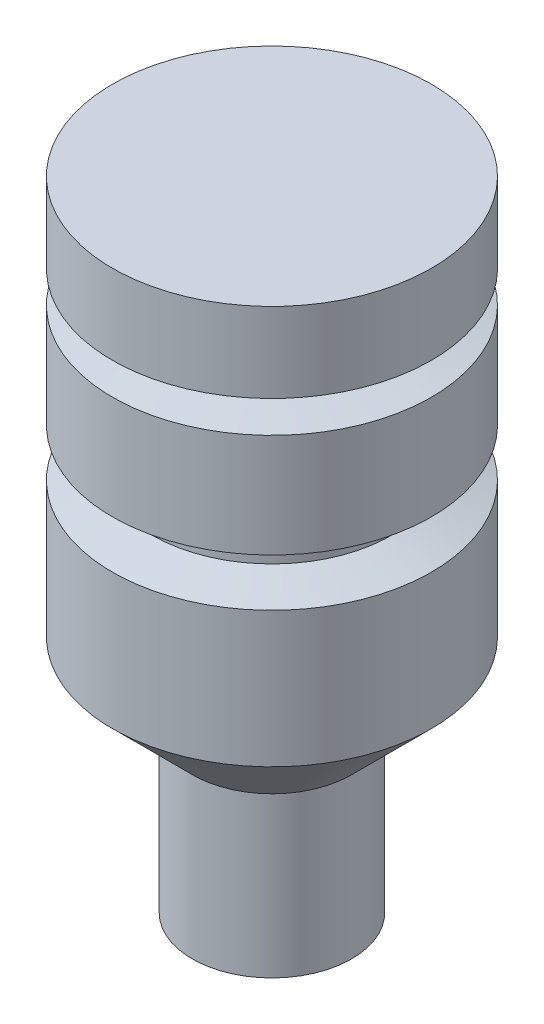
ISO-10303-21;
HEADER;
FILE_DESCRIPTION(('STEP AP214'),'2;1');
FILE_NAME('part.step','',(''),(''),'','','');
FILE_SCHEMA(('AUTOMOTIVE_DESIGN { 1 0 10303 214 1 1 1 1 }'));
ENDSEC;
DATA;
#1=APPLICATION_CONTEXT('core data for automotive mechanical design processes');
#2=APPLICATION_PROTOCOL_DEFINITION('international standard','automotive_design',2000,#1);
#3=PRODUCT_CONTEXT('',#1,'mechanical');
#4=PRODUCT('Part','Part','',(#3));
#5=PRODUCT_RELATED_PRODUCT_CATEGORY('part','',(#4));
#6=PRODUCT_DEFINITION_FORMATION('','',#4);
#7=PRODUCT_DEFINITION_CONTEXT('part definition',#1,'design');
#8=PRODUCT_DEFINITION('design','',#6,#7);
#9=PRODUCT_DEFINITION_SHAPE('','',#8);
#10=(LENGTH_UNIT() NAMED_UNIT(*) SI_UNIT(.MILLI.,.METRE.));
#11=(NAMED_UNIT(*) PLANE_ANGLE_UNIT() SI_UNIT($,.RADIAN.));
#12=(NAMED_UNIT(*) SI_UNIT($,.STERADIAN.) SOLID_ANGLE_UNIT());
#13=UNCERTAINTY_MEASURE_WITH_UNIT(LENGTH_MEASURE(1.E-05),#10,'distance_accuracy_value','');
#14=(GEOMETRIC_REPRESENTATION_CONTEXT(3) GLOBAL_UNCERTAINTY_ASSIGNED_CONTEXT((#13)) GLOBAL_UNIT_ASSIGNED_CONTEXT((#10,
#11,#12)) REPRESENTATION_CONTEXT('',''));
#15=CARTESIAN_POINT('',(0.,0.,0.));
#16=DIRECTION('',(0.,0.,1.));
#17=DIRECTION('',(1.,0.,0.));
#18=AXIS2_PLACEMENT_3D('',#15,#16,#17);
#19=CARTESIAN_POINT('',(5.,0.,0.));
#20=DIRECTION('',(0.,-1.,0.));
#21=DIRECTION('',(0.,0.,-1.));
#22=AXIS2_PLACEMENT_3D('',#19,#20,#21);
#23=PLANE('',#22);
#24=CARTESIAN_POINT('',(0.,0.,0.));
#25=DIRECTION('',(0.,-1.,0.));
#26=DIRECTION('',(0.,0.,-1.));
#27=AXIS2_PLACEMENT_3D('',#24,#25,#26);
#28=CIRCLE('',#27,1.25);
#29=CARTESIAN_POINT('',(0.,0.,-1.25));
#30=VERTEX_POINT('',#29);
#31=EDGE_CURVE('E61',#30,#30,#28,.T.);
#32=ORIENTED_EDGE('',*,*,#31,.F.);
#33=EDGE_LOOP('',(#32));
#34=FACE_BOUND('',#33,.T.);
#35=CARTESIAN_POINT('',(0.,0.,0.));
#36=DIRECTION('',(0.,-1.,0.));
#37=DIRECTION('',(0.,0.,-1.));
#38=AXIS2_PLACEMENT_3D('',#35,#36,#37);
#39=CIRCLE('',#38,5.);
#40=CARTESIAN_POINT('',(0.,0.,-5.));
#41=VERTEX_POINT('',#40);
#42=EDGE_CURVE('E60',#41,#41,#39,.T.);
#43=ORIENTED_EDGE('',*,*,#42,.T.);
#44=EDGE_LOOP('',(#43));
#45=FACE_BOUND('',#44,.T.);
#46=ADVANCED_FACE('F41',(#34,#45),#23,.T.);
#47=CARTESIAN_POINT('',(0.,40.,0.));
#48=DIRECTION('',(0.,1.,0.));
#49=DIRECTION('',(0.,0.,1.));
#50=AXIS2_PLACEMENT_3D('',#47,#48,#49);
#51=PLANE('',#50);
#52=CARTESIAN_POINT('',(0.,40.,0.));
#53=DIRECTION('',(0.,-1.,0.));
#54=DIRECTION('',(0.,0.,-1.));
#55=AXIS2_PLACEMENT_3D('',#52,#53,#54);
#56=CIRCLE('',#55,10.);
#57=CARTESIAN_POINT('',(0.,40.,-10.));
#58=VERTEX_POINT('',#57);
#59=EDGE_CURVE('E11',#58,#58,#56,.T.);
#60=ORIENTED_EDGE('',*,*,#59,.F.);
#61=EDGE_LOOP('',(#60));
#62=FACE_BOUND('',#61,.T.);
#63=ADVANCED_FACE('F102',(#62),#51,.T.);
#64=CARTESIAN_POINT('',(0.,0.,0.));
#65=DIRECTION('',(0.,-1.,0.));
#66=DIRECTION('',(0.,0.,-1.));
#67=AXIS2_PLACEMENT_3D('',#64,#65,#66);
#68=CYLINDRICAL_SURFACE('',#67,10.);
#69=ORIENTED_EDGE('',*,*,#59,.T.);
#70=EDGE_LOOP('',(#69));
#71=FACE_BOUND('',#70,.T.);
#72=CARTESIAN_POINT('',(0.,35.,0.));
#73=DIRECTION('',(0.,-1.,0.));
#74=DIRECTION('',(0.,0.,-1.));
#75=AXIS2_PLACEMENT_3D('',#72,#73,#74);
#76=CIRCLE('',#75,10.);
#77=CARTESIAN_POINT('',(0.,35.,-10.));
#78=VERTEX_POINT('',#77);
#79=EDGE_CURVE('E47',#78,#78,#76,.T.);
#80=ORIENTED_EDGE('',*,*,#79,.F.);
#81=EDGE_LOOP('',(#80));
#82=FACE_BOUND('',#81,.T.);
#83=ADVANCED_FACE('F100',(#71,#82),#68,.T.);
#84=CARTESIAN_POINT('',(0.,34.5,0.));
#85=DIRECTION('',(0.,1.,0.));
#86=DIRECTION('',(0.,0.,1.));
#87=AXIS2_PLACEMENT_3D('',#84,#85,#86);
#88=CONICAL_SURFACE('',#87,7.49999999999998,1.37340076694502);
#89=ORIENTED_EDGE('',*,*,#79,.T.);
#90=EDGE_LOOP('',(#89));
#91=FACE_BOUND('',#90,.T.);
#92=CARTESIAN_POINT('',(0.,34.5,0.));
#93=DIRECTION('',(0.,-1.,0.));
#94=DIRECTION('',(0.,0.,-1.));
#95=AXIS2_PLACEMENT_3D('',#92,#93,#94);
#96=CIRCLE('',#95,7.49999999999998);
#97=CARTESIAN_POINT('',(0.,34.5,-7.49999999999998));
#98=VERTEX_POINT('',#97);
#99=EDGE_CURVE('E92',#98,#98,#96,.T.);
#100=ORIENTED_EDGE('',*,*,#99,.F.);
#101=EDGE_LOOP('',(#100));
#102=FACE_BOUND('',#101,.T.);
#103=ADVANCED_FACE('F97',(#91,#102),#88,.T.);
#104=CARTESIAN_POINT('',(0.,0.,0.));
#105=DIRECTION('',(0.,-1.,0.));
#106=DIRECTION('',(0.,0.,-1.));
#107=AXIS2_PLACEMENT_3D('',#104,#105,#106);
#108=CYLINDRICAL_SURFACE('',#107,7.49999999999998);
#109=ORIENTED_EDGE('',*,*,#99,.T.);
#110=EDGE_LOOP('',(#109));
#111=FACE_BOUND('',#110,.T.);
#112=CARTESIAN_POINT('',(0.,33.5,0.));
#113=DIRECTION('',(0.,-1.,0.));
#114=DIRECTION('',(0.,0.,-1.));
#115=AXIS2_PLACEMENT_3D('',#112,#113,#114);
#116=CIRCLE('',#115,7.49999999999998);
#117=CARTESIAN_POINT('',(0.,33.5,-7.49999999999998));
#118=VERTEX_POINT('',#117);
#119=EDGE_CURVE('E89',#118,#118,#116,.T.);
#120=ORIENTED_EDGE('',*,*,#119,.F.);
#121=EDGE_LOOP('',(#120));
#122=FACE_BOUND('',#121,.T.);
#123=ADVANCED_FACE('F109',(#111,#122),#108,.T.);
#124=CARTESIAN_POINT('',(0.,33.,0.));
#125=DIRECTION('',(0.,-1.,0.));
#126=DIRECTION('',(0.,0.,-1.));
#127=AXIS2_PLACEMENT_3D('',#124,#125,#126);
#128=CONICAL_SURFACE('',#127,10.,1.37340076694502);
#129=ORIENTED_EDGE('',*,*,#119,.T.);
#130=EDGE_LOOP('',(#129));
#131=FACE_BOUND('',#130,.T.);
#132=CARTESIAN_POINT('',(0.,33.,0.));
#133=DIRECTION('',(0.,-1.,0.));
#134=DIRECTION('',(0.,0.,-1.));
#135=AXIS2_PLACEMENT_3D('',#132,#133,#134);
#136=CIRCLE('',#135,10.);
#137=CARTESIAN_POINT('',(0.,33.,-10.));
#138=VERTEX_POINT('',#137);
#139=EDGE_CURVE('E86',#138,#138,#136,.T.);
#140=ORIENTED_EDGE('',*,*,#139,.F.);
#141=EDGE_LOOP('',(#140));
#142=FACE_BOUND('',#141,.T.);
#143=ADVANCED_FACE('F150',(#131,#142),#128,.T.);
#144=CARTESIAN_POINT('',(0.,0.,0.));
#145=DIRECTION('',(0.,-1.,0.));
#146=DIRECTION('',(0.,0.,-1.));
#147=AXIS2_PLACEMENT_3D('',#144,#145,#146);
#148=CYLINDRICAL_SURFACE('',#147,10.);
#149=ORIENTED_EDGE('',*,*,#139,.T.);
#150=EDGE_LOOP('',(#149));
#151=FACE_BOUND('',#150,.T.);
#152=CARTESIAN_POINT('',(0.,26.5,0.));
#153=DIRECTION('',(0.,-1.,0.));
#154=DIRECTION('',(0.,0.,-1.));
#155=AXIS2_PLACEMENT_3D('',#152,#153,#154);
#156=CIRCLE('',#155,10.);
#157=CARTESIAN_POINT('',(0.,26.5,-10.));
#158=VERTEX_POINT('',#157);
#159=EDGE_CURVE('E83',#158,#158,#156,.T.);
#160=ORIENTED_EDGE('',*,*,#159,.F.);
#161=EDGE_LOOP('',(#160));
#162=FACE_BOUND('',#161,.T.);
#163=ADVANCED_FACE('F146',(#151,#162),#148,.T.);
#164=CARTESIAN_POINT('',(0.,25.75,0.));
#165=DIRECTION('',(0.,1.,0.));
#166=DIRECTION('',(0.,0.,1.));
#167=AXIS2_PLACEMENT_3D('',#164,#165,#166);
#168=CONICAL_SURFACE('',#167,7.5,1.27933953231703);
#169=ORIENTED_EDGE('',*,*,#159,.T.);
#170=EDGE_LOOP('',(#169));
#171=FACE_BOUND('',#170,.T.);
#172=CARTESIAN_POINT('',(0.,25.75,0.));
#173=DIRECTION('',(0.,-1.,0.));
#174=DIRECTION('',(0.,0.,-1.));
#175=AXIS2_PLACEMENT_3D('',#172,#173,#174);
#176=CIRCLE('',#175,7.5);
#177=CARTESIAN_POINT('',(0.,25.75,-7.5));
#178=VERTEX_POINT('',#177);
#179=EDGE_CURVE('E80',#178,#178,#176,.T.);
#180=ORIENTED_EDGE('',*,*,#179,.F.);
#181=EDGE_LOOP('',(#180));
#182=FACE_BOUND('',#181,.T.);
#183=ADVANCED_FACE('F142',(#171,#182),#168,.T.);
#184=CARTESIAN_POINT('',(0.,0.,0.));
#185=DIRECTION('',(0.,-1.,0.));
#186=DIRECTION('',(0.,0.,-1.));
#187=AXIS2_PLACEMENT_3D('',#184,#185,#186);
#188=CYLINDRICAL_SURFACE('',#187,7.5);
#189=ORIENTED_EDGE('',*,*,#179,.T.);
#190=EDGE_LOOP('',(#189));
#191=FACE_BOUND('',#190,.T.);
#192=CARTESIAN_POINT('',(0.,24.25,0.));
#193=DIRECTION('',(0.,-1.,0.));
#194=DIRECTION('',(0.,0.,-1.));
#195=AXIS2_PLACEMENT_3D('',#192,#193,#194);
#196=CIRCLE('',#195,7.5);
#197=CARTESIAN_POINT('',(0.,24.25,-7.5));
#198=VERTEX_POINT('',#197);
#199=EDGE_CURVE('E77',#198,#198,#196,.T.);
#200=ORIENTED_EDGE('',*,*,#199,.F.);
#201=EDGE_LOOP('',(#200));
#202=FACE_BOUND('',#201,.T.);
#203=ADVANCED_FACE('F138',(#191,#202),#188,.T.);
#204=CARTESIAN_POINT('',(0.,23.5,0.));
#205=DIRECTION('',(0.,-1.,0.));
#206=DIRECTION('',(0.,0.,-1.));
#207=AXIS2_PLACEMENT_3D('',#204,#205,#206);
#208=CONICAL_SURFACE('',#207,10.,1.27933953231703);
#209=ORIENTED_EDGE('',*,*,#199,.T.);
#210=EDGE_LOOP('',(#209));
#211=FACE_BOUND('',#210,.T.);
#212=CARTESIAN_POINT('',(0.,23.5,0.));
#213=DIRECTION('',(0.,-1.,0.));
#214=DIRECTION('',(0.,0.,-1.));
#215=AXIS2_PLACEMENT_3D('',#212,#213,#214);
#216=CIRCLE('',#215,10.);
#217=CARTESIAN_POINT('',(0.,23.5,-10.));
#218=VERTEX_POINT('',#217);
#219=EDGE_CURVE('E74',#218,#218,#216,.T.);
#220=ORIENTED_EDGE('',*,*,#219,.F.);
#221=EDGE_LOOP('',(#220));
#222=FACE_BOUND('',#221,.T.);
#223=ADVANCED_FACE('F134',(#211,#222),#208,.T.);
#224=CARTESIAN_POINT('',(0.,0.,0.));
#225=DIRECTION('',(0.,-1.,0.));
#226=DIRECTION('',(0.,0.,-1.));
#227=AXIS2_PLACEMENT_3D('',#224,#225,#226);
#228=CYLINDRICAL_SURFACE('',#227,10.);
#229=ORIENTED_EDGE('',*,*,#219,.T.);
#230=EDGE_LOOP('',(#229));
#231=FACE_BOUND('',#230,.T.);
#232=CARTESIAN_POINT('',(0.,15.,0.));
#233=DIRECTION('',(0.,-1.,0.));
#234=DIRECTION('',(0.,0.,-1.));
#235=AXIS2_PLACEMENT_3D('',#232,#233,#234);
#236=CIRCLE('',#235,10.);
#237=CARTESIAN_POINT('',(0.,15.,-10.));
#238=VERTEX_POINT('',#237);
#239=EDGE_CURVE('E71',#238,#238,#236,.T.);
#240=ORIENTED_EDGE('',*,*,#239,.F.);
#241=EDGE_LOOP('',(#240));
#242=FACE_BOUND('',#241,.T.);
#243=ADVANCED_FACE('F127',(#231,#242),#228,.T.);
#244=CARTESIAN_POINT('',(0.,10.,0.));
#245=DIRECTION('',(0.,1.,0.));
#246=DIRECTION('',(0.,0.,1.));
#247=AXIS2_PLACEMENT_3D('',#244,#245,#246);
#248=CONICAL_SURFACE('',#247,5.,0.785398163397449);
#249=ORIENTED_EDGE('',*,*,#239,.T.);
#250=EDGE_LOOP('',(#249));
#251=FACE_BOUND('',#250,.T.);
#252=CARTESIAN_POINT('',(0.,10.,0.));
#253=DIRECTION('',(0.,-1.,0.));
#254=DIRECTION('',(0.,0.,-1.));
#255=AXIS2_PLACEMENT_3D('',#252,#253,#254);
#256=CIRCLE('',#255,5.);
#257=CARTESIAN_POINT('',(0.,10.,-5.));
#258=VERTEX_POINT('',#257);
#259=EDGE_CURVE('E64',#258,#258,#256,.T.);
#260=ORIENTED_EDGE('',*,*,#259,.F.);
#261=EDGE_LOOP('',(#260));
#262=FACE_BOUND('',#261,.T.);
#263=ADVANCED_FACE('F121',(#251,#262),#248,.T.);
#264=CARTESIAN_POINT('',(0.,0.,0.));
#265=DIRECTION('',(0.,-1.,0.));
#266=DIRECTION('',(0.,0.,-1.));
#267=AXIS2_PLACEMENT_3D('',#264,#265,#266);
#268=CYLINDRICAL_SURFACE('',#267,5.);
#269=ORIENTED_EDGE('',*,*,#259,.T.);
#270=EDGE_LOOP('',(#269));
#271=FACE_BOUND('',#270,.T.);
#272=ORIENTED_EDGE('',*,*,#42,.F.);
#273=EDGE_LOOP('',(#272));
#274=FACE_BOUND('',#273,.T.);
#275=ADVANCED_FACE('F54',(#271,#274),#268,.T.);
#276=CARTESIAN_POINT('',(0.,20.,0.));
#277=DIRECTION('',(0.,-1.,0.));
#278=DIRECTION('',(0.,0.,-1.));
#279=AXIS2_PLACEMENT_3D('',#276,#277,#278);
#280=CONICAL_SURFACE('',#279,1.25,1.02974425867665);
#281=CARTESIAN_POINT('',(0.,20.7510757737845,0.));
#282=VERTEX_POINT('',#281);
#283=VERTEX_LOOP('',#282);
#284=FACE_BOUND('',#283,.T.);
#285=CARTESIAN_POINT('',(0.,20.,0.));
#286=DIRECTION('',(0.,-1.,0.));
#287=DIRECTION('',(0.,0.,-1.));
#288=AXIS2_PLACEMENT_3D('',#285,#286,#287);
#289=CIRCLE('',#288,1.25);
#290=CARTESIAN_POINT('',(0.,20.,-1.25));
#291=VERTEX_POINT('',#290);
#292=EDGE_CURVE('E58',#291,#291,#289,.T.);
#293=ORIENTED_EDGE('',*,*,#292,.T.);
#294=EDGE_LOOP('',(#293));
#295=FACE_BOUND('',#294,.T.);
#296=ADVANCED_FACE('F50',(#284,#295),#280,.F.);
#297=CARTESIAN_POINT('',(0.,0.,0.));
#298=DIRECTION('',(0.,-1.,0.));
#299=DIRECTION('',(0.,0.,-1.));
#300=AXIS2_PLACEMENT_3D('',#297,#298,#299);
#301=CYLINDRICAL_SURFACE('',#300,1.25);
#302=ORIENTED_EDGE('',*,*,#292,.F.);
#303=EDGE_LOOP('',(#302));
#304=FACE_BOUND('',#303,.T.);
#305=ORIENTED_EDGE('',*,*,#31,.T.);
#306=EDGE_LOOP('',(#305));
#307=FACE_BOUND('',#306,.T.);
#308=ADVANCED_FACE('F53',(#304,#307),#301,.F.);
#309=CLOSED_SHELL('',(#46,#63,#83,#103,#123,#143,#163,#183,#203,#223,#243,#263,#275,#296,#308));
#310=MANIFOLD_SOLID_BREP('B2',#309);
#311=ADVANCED_BREP_SHAPE_REPRESENTATION('',(#18,#310),#14);
#312=SHAPE_DEFINITION_REPRESENTATION(#9,#311);
ENDSEC;
END-ISO-10303-21;
